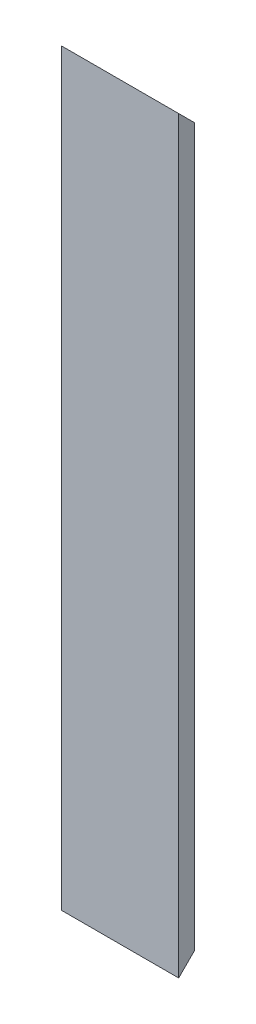
ISO-10303-21;
HEADER;
FILE_DESCRIPTION(('STEP AP214'),'2;1');
FILE_NAME('part.step','',(''),(''),'','','');
FILE_SCHEMA(('AUTOMOTIVE_DESIGN { 1 0 10303 214 1 1 1 1 }'));
ENDSEC;
DATA;
#1=APPLICATION_CONTEXT('core data for automotive mechanical design processes');
#2=APPLICATION_PROTOCOL_DEFINITION('international standard','automotive_design',2000,#1);
#3=PRODUCT_CONTEXT('',#1,'mechanical');
#4=PRODUCT('Part','Part','',(#3));
#5=PRODUCT_RELATED_PRODUCT_CATEGORY('part','',(#4));
#6=PRODUCT_DEFINITION_FORMATION('','',#4);
#7=PRODUCT_DEFINITION_CONTEXT('part definition',#1,'design');
#8=PRODUCT_DEFINITION('design','',#6,#7);
#9=PRODUCT_DEFINITION_SHAPE('','',#8);
#10=(LENGTH_UNIT() NAMED_UNIT(*) SI_UNIT(.MILLI.,.METRE.));
#11=(NAMED_UNIT(*) PLANE_ANGLE_UNIT() SI_UNIT($,.RADIAN.));
#12=(NAMED_UNIT(*) SI_UNIT($,.STERADIAN.) SOLID_ANGLE_UNIT());
#13=UNCERTAINTY_MEASURE_WITH_UNIT(LENGTH_MEASURE(1.E-05),#10,'distance_accuracy_value','');
#14=(GEOMETRIC_REPRESENTATION_CONTEXT(3) GLOBAL_UNCERTAINTY_ASSIGNED_CONTEXT((#13)) GLOBAL_UNIT_ASSIGNED_CONTEXT((#10,
#11,#12)) REPRESENTATION_CONTEXT('',''));
#15=CARTESIAN_POINT('',(0.,0.,0.));
#16=DIRECTION('',(0.,0.,1.));
#17=DIRECTION('',(1.,0.,0.));
#18=AXIS2_PLACEMENT_3D('',#15,#16,#17);
#19=CARTESIAN_POINT('',(-7.5,96.,-0.999999999999996));
#20=DIRECTION('',(1.,0.,0.));
#21=DIRECTION('',(0.,0.,-1.));
#22=AXIS2_PLACEMENT_3D('',#19,#20,#21);
#23=PLANE('',#22);
#24=DIRECTION('',(0.,-1.,0.));
#25=VECTOR('',#24,1.);
#26=CARTESIAN_POINT('',(-7.5,96.,-0.999999999999996));
#27=LINE('',#26,#25);
#28=CARTESIAN_POINT('',(-7.5,94.,-0.999999999999996));
#29=VERTEX_POINT('',#28);
#30=CARTESIAN_POINT('',(-7.5,2.00000000000002,-0.999999999999996));
#31=VERTEX_POINT('',#30);
#32=EDGE_CURVE('E94',#29,#31,#27,.T.);
#33=ORIENTED_EDGE('',*,*,#32,.T.);
#34=DIRECTION('',(0.,0.707106781186548,-0.707106781186548));
#35=VECTOR('',#34,1.);
#36=CARTESIAN_POINT('',(-7.5,2.00000000000002,-0.999999999999996));
#37=LINE('',#36,#35);
#38=CARTESIAN_POINT('',(-7.5,0.,1.));
#39=VERTEX_POINT('',#38);
#40=EDGE_CURVE('E84',#31,#39,#37,.F.);
#41=ORIENTED_EDGE('',*,*,#40,.T.);
#42=DIRECTION('',(0.,-1.,0.));
#43=VECTOR('',#42,1.);
#44=CARTESIAN_POINT('',(-7.5,96.,1.));
#45=LINE('',#44,#43);
#46=CARTESIAN_POINT('',(-7.5,96.,1.));
#47=VERTEX_POINT('',#46);
#48=EDGE_CURVE('E91',#47,#39,#45,.T.);
#49=ORIENTED_EDGE('',*,*,#48,.F.);
#50=DIRECTION('',(0.,-0.707106781186548,-0.707106781186548));
#51=VECTOR('',#50,1.);
#52=CARTESIAN_POINT('',(-7.5,96.,1.00000000000002));
#53=LINE('',#52,#51);
#54=EDGE_CURVE('E77',#47,#29,#53,.T.);
#55=ORIENTED_EDGE('',*,*,#54,.T.);
#56=EDGE_LOOP('',(#33,#41,#49,#55));
#57=FACE_BOUND('',#56,.T.);
#58=ADVANCED_FACE('F36',(#57),#23,.F.);
#59=CARTESIAN_POINT('',(-7.5,96.,1.));
#60=DIRECTION('',(0.,0.,-1.));
#61=DIRECTION('',(-1.,0.,0.));
#62=AXIS2_PLACEMENT_3D('',#59,#60,#61);
#63=PLANE('',#62);
#64=DIRECTION('',(1.,0.,0.));
#65=VECTOR('',#64,1.);
#66=CARTESIAN_POINT('',(-7.5,0.,1.));
#67=LINE('',#66,#65);
#68=CARTESIAN_POINT('',(7.5,0.,1.));
#69=VERTEX_POINT('',#68);
#70=EDGE_CURVE('E95',#39,#69,#67,.T.);
#71=ORIENTED_EDGE('',*,*,#70,.T.);
#72=DIRECTION('',(0.,-1.,0.));
#73=VECTOR('',#72,1.);
#74=CARTESIAN_POINT('',(7.5,96.,1.));
#75=LINE('',#74,#73);
#76=CARTESIAN_POINT('',(7.5,96.,1.));
#77=VERTEX_POINT('',#76);
#78=EDGE_CURVE('E93',#77,#69,#75,.T.);
#79=ORIENTED_EDGE('',*,*,#78,.F.);
#80=DIRECTION('',(1.,0.,0.));
#81=VECTOR('',#80,1.);
#82=CARTESIAN_POINT('',(-7.5,96.,1.));
#83=LINE('',#82,#81);
#84=EDGE_CURVE('E80',#47,#77,#83,.T.);
#85=ORIENTED_EDGE('',*,*,#84,.F.);
#86=ORIENTED_EDGE('',*,*,#48,.T.);
#87=EDGE_LOOP('',(#71,#79,#85,#86));
#88=FACE_BOUND('',#87,.T.);
#89=ADVANCED_FACE('F90',(#88),#63,.F.);
#90=CARTESIAN_POINT('',(7.5,96.,-0.999999999999999));
#91=DIRECTION('',(-1.,0.,0.));
#92=DIRECTION('',(0.,0.,1.));
#93=AXIS2_PLACEMENT_3D('',#90,#91,#92);
#94=PLANE('',#93);
#95=ORIENTED_EDGE('',*,*,#78,.T.);
#96=DIRECTION('',(0.,-0.707106781186548,0.707106781186548));
#97=VECTOR('',#96,1.);
#98=CARTESIAN_POINT('',(7.5,2.00000000000001,-0.999999999999997));
#99=LINE('',#98,#97);
#100=CARTESIAN_POINT('',(7.5,2.00000000000002,-0.999999999999999));
#101=VERTEX_POINT('',#100);
#102=EDGE_CURVE('E11',#69,#101,#99,.F.);
#103=ORIENTED_EDGE('',*,*,#102,.T.);
#104=DIRECTION('',(0.,-1.,0.));
#105=VECTOR('',#104,1.);
#106=CARTESIAN_POINT('',(7.5,96.,-0.999999999999999));
#107=LINE('',#106,#105);
#108=CARTESIAN_POINT('',(7.5,94.,-0.999999999999999));
#109=VERTEX_POINT('',#108);
#110=EDGE_CURVE('E99',#109,#101,#107,.T.);
#111=ORIENTED_EDGE('',*,*,#110,.F.);
#112=DIRECTION('',(0.,0.707106781186548,0.707106781186548));
#113=VECTOR('',#112,1.);
#114=CARTESIAN_POINT('',(7.5,96.,1.00000000000002));
#115=LINE('',#114,#113);
#116=EDGE_CURVE('E45',#109,#77,#115,.T.);
#117=ORIENTED_EDGE('',*,*,#116,.T.);
#118=EDGE_LOOP('',(#95,#103,#111,#117));
#119=FACE_BOUND('',#118,.T.);
#120=ADVANCED_FACE('F105',(#119),#94,.F.);
#121=CARTESIAN_POINT('',(-7.5,96.,-0.999999999999996));
#122=DIRECTION('',(0.,0.,1.));
#123=DIRECTION('',(1.,0.,0.));
#124=AXIS2_PLACEMENT_3D('',#121,#122,#123);
#125=PLANE('',#124);
#126=ORIENTED_EDGE('',*,*,#110,.T.);
#127=DIRECTION('',(-1.,0.,0.));
#128=VECTOR('',#127,1.);
#129=CARTESIAN_POINT('',(-7.5,2.00000000000002,-0.999999999999996));
#130=LINE('',#129,#128);
#131=EDGE_CURVE('E85',#101,#31,#130,.T.);
#132=ORIENTED_EDGE('',*,*,#131,.T.);
#133=ORIENTED_EDGE('',*,*,#32,.F.);
#134=DIRECTION('',(1.,0.,0.));
#135=VECTOR('',#134,1.);
#136=CARTESIAN_POINT('',(7.5,94.,-0.999999999999999));
#137=LINE('',#136,#135);
#138=EDGE_CURVE('E57',#29,#109,#137,.T.);
#139=ORIENTED_EDGE('',*,*,#138,.T.);
#140=EDGE_LOOP('',(#126,#132,#133,#139));
#141=FACE_BOUND('',#140,.T.);
#142=ADVANCED_FACE('F111',(#141),#125,.F.);
#143=CARTESIAN_POINT('',(-7.5,2.00000000000002,-0.999999999999996));
#144=DIRECTION('',(0.,0.707106781186547,0.707106781186547));
#145=DIRECTION('',(-1.,0.,0.));
#146=AXIS2_PLACEMENT_3D('',#143,#144,#145);
#147=PLANE('',#146);
#148=ORIENTED_EDGE('',*,*,#102,.F.);
#149=ORIENTED_EDGE('',*,*,#70,.F.);
#150=ORIENTED_EDGE('',*,*,#40,.F.);
#151=ORIENTED_EDGE('',*,*,#131,.F.);
#152=EDGE_LOOP('',(#148,#149,#150,#151));
#153=FACE_BOUND('',#152,.T.);
#154=ADVANCED_FACE('F110',(#153),#147,.F.);
#155=CARTESIAN_POINT('',(0.,96.,1.00000000000002));
#156=DIRECTION('',(0.,0.707106781186547,-0.707106781186547));
#157=DIRECTION('',(1.,0.,0.));
#158=AXIS2_PLACEMENT_3D('',#155,#156,#157);
#159=PLANE('',#158);
#160=ORIENTED_EDGE('',*,*,#116,.F.);
#161=ORIENTED_EDGE('',*,*,#138,.F.);
#162=ORIENTED_EDGE('',*,*,#54,.F.);
#163=ORIENTED_EDGE('',*,*,#84,.T.);
#164=EDGE_LOOP('',(#160,#161,#162,#163));
#165=FACE_BOUND('',#164,.T.);
#166=ADVANCED_FACE('F39',(#165),#159,.T.);
#167=CLOSED_SHELL('',(#58,#89,#120,#142,#154,#166));
#168=MANIFOLD_SOLID_BREP('B2',#167);
#169=ADVANCED_BREP_SHAPE_REPRESENTATION('',(#18,#168),#14);
#170=SHAPE_DEFINITION_REPRESENTATION(#9,#169);
ENDSEC;
END-ISO-10303-21;
